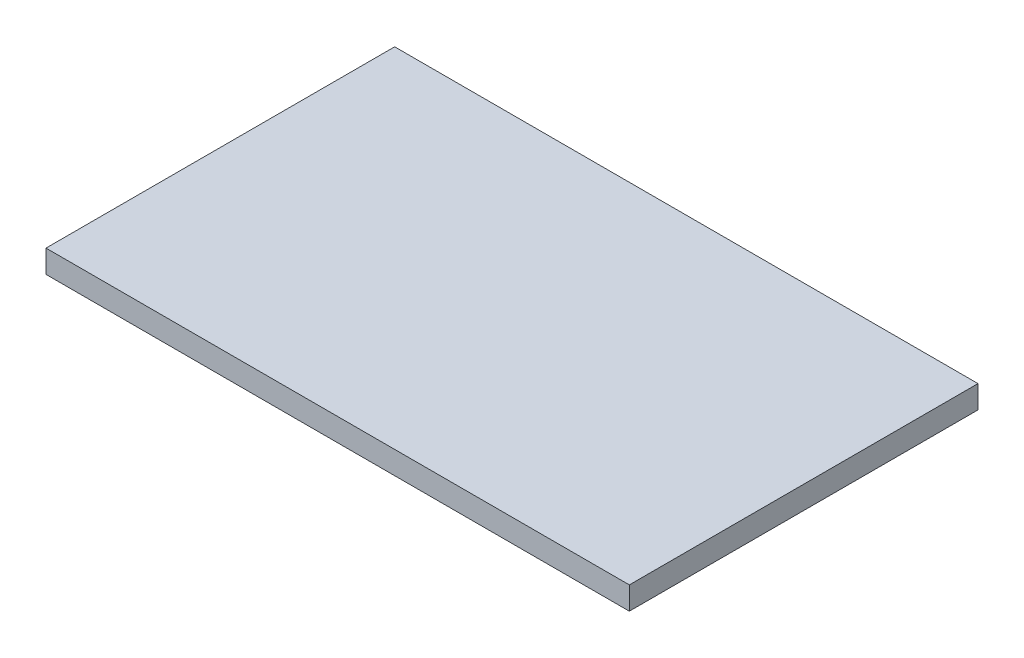
ISO-10303-21;
HEADER;
FILE_DESCRIPTION(('STEP AP214'),'2;1');
FILE_NAME('part.step','',(''),(''),'','','');
FILE_SCHEMA(('AUTOMOTIVE_DESIGN { 1 0 10303 214 1 1 1 1 }'));
ENDSEC;
DATA;
#1=APPLICATION_CONTEXT('core data for automotive mechanical design processes');
#2=APPLICATION_PROTOCOL_DEFINITION('international standard','automotive_design',2000,#1);
#3=PRODUCT_CONTEXT('',#1,'mechanical');
#4=PRODUCT('Part','Part','',(#3));
#5=PRODUCT_RELATED_PRODUCT_CATEGORY('part','',(#4));
#6=PRODUCT_DEFINITION_FORMATION('','',#4);
#7=PRODUCT_DEFINITION_CONTEXT('part definition',#1,'design');
#8=PRODUCT_DEFINITION('design','',#6,#7);
#9=PRODUCT_DEFINITION_SHAPE('','',#8);
#10=(LENGTH_UNIT() NAMED_UNIT(*) SI_UNIT(.MILLI.,.METRE.));
#11=(NAMED_UNIT(*) PLANE_ANGLE_UNIT() SI_UNIT($,.RADIAN.));
#12=(NAMED_UNIT(*) SI_UNIT($,.STERADIAN.) SOLID_ANGLE_UNIT());
#13=UNCERTAINTY_MEASURE_WITH_UNIT(LENGTH_MEASURE(1.E-05),#10,'distance_accuracy_value','');
#14=(GEOMETRIC_REPRESENTATION_CONTEXT(3) GLOBAL_UNCERTAINTY_ASSIGNED_CONTEXT((#13)) GLOBAL_UNIT_ASSIGNED_CONTEXT((#10,
#11,#12)) REPRESENTATION_CONTEXT('',''));
#15=CARTESIAN_POINT('',(0.,0.,0.));
#16=DIRECTION('',(0.,0.,1.));
#17=DIRECTION('',(1.,0.,0.));
#18=AXIS2_PLACEMENT_3D('',#15,#16,#17);
#19=CARTESIAN_POINT('',(0.,2.,0.));
#20=DIRECTION('',(1.,0.,0.));
#21=DIRECTION('',(0.,0.,-1.));
#22=AXIS2_PLACEMENT_3D('',#19,#20,#21);
#23=PLANE('',#22);
#24=DIRECTION('',(0.,0.,1.));
#25=VECTOR('',#24,1.);
#26=CARTESIAN_POINT('',(0.,0.,0.));
#27=LINE('',#26,#25);
#28=CARTESIAN_POINT('',(0.,0.,-30.5732544138341));
#29=VERTEX_POINT('',#28);
#30=CARTESIAN_POINT('',(0.,0.,0.));
#31=VERTEX_POINT('',#30);
#32=EDGE_CURVE('E107',#29,#31,#27,.T.);
#33=ORIENTED_EDGE('',*,*,#32,.T.);
#34=DIRECTION('',(0.,-1.,0.));
#35=VECTOR('',#34,1.);
#36=CARTESIAN_POINT('',(0.,2.,0.));
#37=LINE('',#36,#35);
#38=CARTESIAN_POINT('',(0.,2.,0.));
#39=VERTEX_POINT('',#38);
#40=EDGE_CURVE('E11',#39,#31,#37,.T.);
#41=ORIENTED_EDGE('',*,*,#40,.F.);
#42=DIRECTION('',(0.,0.,1.));
#43=VECTOR('',#42,1.);
#44=CARTESIAN_POINT('',(0.,2.,0.));
#45=LINE('',#44,#43);
#46=CARTESIAN_POINT('',(0.,2.,-30.5732544138341));
#47=VERTEX_POINT('',#46);
#48=EDGE_CURVE('E91',#47,#39,#45,.T.);
#49=ORIENTED_EDGE('',*,*,#48,.F.);
#50=DIRECTION('',(0.,-1.,0.));
#51=VECTOR('',#50,1.);
#52=CARTESIAN_POINT('',(0.,2.,-30.5732544138341));
#53=LINE('',#52,#51);
#54=EDGE_CURVE('E103',#47,#29,#53,.T.);
#55=ORIENTED_EDGE('',*,*,#54,.T.);
#56=EDGE_LOOP('',(#33,#41,#49,#55));
#57=FACE_BOUND('',#56,.T.);
#58=ADVANCED_FACE('F39',(#57),#23,.F.);
#59=CARTESIAN_POINT('',(0.,2.,0.));
#60=DIRECTION('',(0.,0.,-1.));
#61=DIRECTION('',(-1.,0.,0.));
#62=AXIS2_PLACEMENT_3D('',#59,#60,#61);
#63=PLANE('',#62);
#64=DIRECTION('',(1.,0.,0.));
#65=VECTOR('',#64,1.);
#66=CARTESIAN_POINT('',(0.,0.,0.));
#67=LINE('',#66,#65);
#68=CARTESIAN_POINT('',(51.1514064231456,0.,0.));
#69=VERTEX_POINT('',#68);
#70=EDGE_CURVE('E96',#31,#69,#67,.T.);
#71=ORIENTED_EDGE('',*,*,#70,.T.);
#72=DIRECTION('',(0.,-1.,0.));
#73=VECTOR('',#72,1.);
#74=CARTESIAN_POINT('',(51.1514064231456,2.,0.));
#75=LINE('',#74,#73);
#76=CARTESIAN_POINT('',(51.1514064231456,2.,0.));
#77=VERTEX_POINT('',#76);
#78=EDGE_CURVE('E48',#77,#69,#75,.T.);
#79=ORIENTED_EDGE('',*,*,#78,.F.);
#80=DIRECTION('',(1.,0.,0.));
#81=VECTOR('',#80,1.);
#82=CARTESIAN_POINT('',(0.,2.,0.));
#83=LINE('',#82,#81);
#84=EDGE_CURVE('E86',#39,#77,#83,.T.);
#85=ORIENTED_EDGE('',*,*,#84,.F.);
#86=ORIENTED_EDGE('',*,*,#40,.T.);
#87=EDGE_LOOP('',(#71,#79,#85,#86));
#88=FACE_BOUND('',#87,.T.);
#89=ADVANCED_FACE('F95',(#88),#63,.F.);
#90=CARTESIAN_POINT('',(51.1514064231456,2.,0.));
#91=DIRECTION('',(-1.,0.,0.));
#92=DIRECTION('',(0.,0.,1.));
#93=AXIS2_PLACEMENT_3D('',#90,#91,#92);
#94=PLANE('',#93);
#95=DIRECTION('',(0.,0.,-1.));
#96=VECTOR('',#95,1.);
#97=CARTESIAN_POINT('',(51.1514064231456,0.,0.));
#98=LINE('',#97,#96);
#99=CARTESIAN_POINT('',(51.1514064231456,0.,-30.5732544138341));
#100=VERTEX_POINT('',#99);
#101=EDGE_CURVE('E73',#69,#100,#98,.T.);
#102=ORIENTED_EDGE('',*,*,#101,.T.);
#103=DIRECTION('',(0.,-1.,0.));
#104=VECTOR('',#103,1.);
#105=CARTESIAN_POINT('',(51.1514064231456,2.,-30.5732544138341));
#106=LINE('',#105,#104);
#107=CARTESIAN_POINT('',(51.1514064231456,2.,-30.5732544138341));
#108=VERTEX_POINT('',#107);
#109=EDGE_CURVE('E98',#108,#100,#106,.T.);
#110=ORIENTED_EDGE('',*,*,#109,.F.);
#111=DIRECTION('',(0.,0.,-1.));
#112=VECTOR('',#111,1.);
#113=CARTESIAN_POINT('',(51.1514064231456,2.,0.));
#114=LINE('',#113,#112);
#115=EDGE_CURVE('E89',#77,#108,#114,.T.);
#116=ORIENTED_EDGE('',*,*,#115,.F.);
#117=ORIENTED_EDGE('',*,*,#78,.T.);
#118=EDGE_LOOP('',(#102,#110,#116,#117));
#119=FACE_BOUND('',#118,.T.);
#120=ADVANCED_FACE('F99',(#119),#94,.F.);
#121=CARTESIAN_POINT('',(0.,2.,-30.5732544138341));
#122=DIRECTION('',(0.,0.,1.));
#123=DIRECTION('',(1.,0.,0.));
#124=AXIS2_PLACEMENT_3D('',#121,#122,#123);
#125=PLANE('',#124);
#126=DIRECTION('',(-1.,0.,0.));
#127=VECTOR('',#126,1.);
#128=CARTESIAN_POINT('',(0.,0.,-30.5732544138341));
#129=LINE('',#128,#127);
#130=EDGE_CURVE('E79',#100,#29,#129,.T.);
#131=ORIENTED_EDGE('',*,*,#130,.T.);
#132=ORIENTED_EDGE('',*,*,#54,.F.);
#133=DIRECTION('',(-1.,0.,0.));
#134=VECTOR('',#133,1.);
#135=CARTESIAN_POINT('',(0.,2.,-30.5732544138341));
#136=LINE('',#135,#134);
#137=EDGE_CURVE('E56',#108,#47,#136,.T.);
#138=ORIENTED_EDGE('',*,*,#137,.F.);
#139=ORIENTED_EDGE('',*,*,#109,.T.);
#140=EDGE_LOOP('',(#131,#132,#138,#139));
#141=FACE_BOUND('',#140,.T.);
#142=ADVANCED_FACE('F120',(#141),#125,.F.);
#143=CARTESIAN_POINT('',(0.,2.,0.));
#144=DIRECTION('',(0.,-1.,0.));
#145=DIRECTION('',(0.,0.,-1.));
#146=AXIS2_PLACEMENT_3D('',#143,#144,#145);
#147=PLANE('',#146);
#148=ORIENTED_EDGE('',*,*,#48,.T.);
#149=ORIENTED_EDGE('',*,*,#84,.T.);
#150=ORIENTED_EDGE('',*,*,#115,.T.);
#151=ORIENTED_EDGE('',*,*,#137,.T.);
#152=EDGE_LOOP('',(#148,#149,#150,#151));
#153=FACE_BOUND('',#152,.T.);
#154=ADVANCED_FACE('F87',(#153),#147,.F.);
#155=CARTESIAN_POINT('',(0.,0.,0.));
#156=DIRECTION('',(0.,-1.,0.));
#157=DIRECTION('',(0.,0.,-1.));
#158=AXIS2_PLACEMENT_3D('',#155,#156,#157);
#159=PLANE('',#158);
#160=ORIENTED_EDGE('',*,*,#32,.F.);
#161=ORIENTED_EDGE('',*,*,#130,.F.);
#162=ORIENTED_EDGE('',*,*,#101,.F.);
#163=ORIENTED_EDGE('',*,*,#70,.F.);
#164=EDGE_LOOP('',(#160,#161,#162,#163));
#165=FACE_BOUND('',#164,.T.);
#166=ADVANCED_FACE('F123',(#165),#159,.T.);
#167=CLOSED_SHELL('',(#58,#89,#120,#142,#154,#166));
#168=MANIFOLD_SOLID_BREP('B2',#167);
#169=ADVANCED_BREP_SHAPE_REPRESENTATION('',(#18,#168),#14);
#170=SHAPE_DEFINITION_REPRESENTATION(#9,#169);
ENDSEC;
END-ISO-10303-21;
